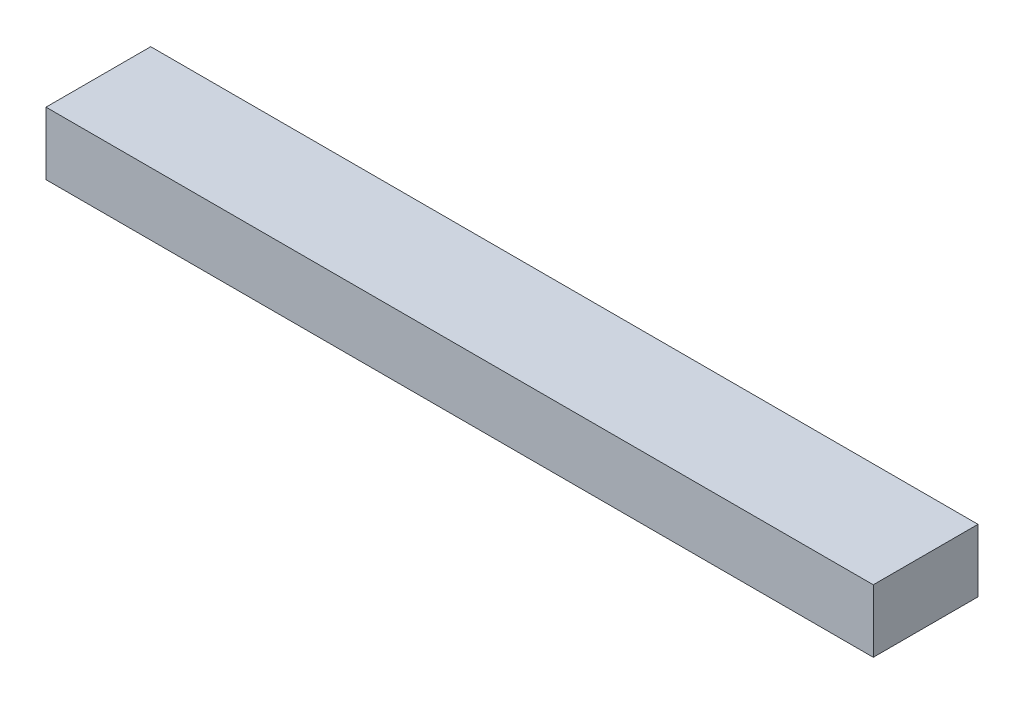
ISO-10303-21;
HEADER;
FILE_DESCRIPTION(('STEP AP214'),'2;1');
FILE_NAME('part.step','',(''),(''),'','','');
FILE_SCHEMA(('AUTOMOTIVE_DESIGN { 1 0 10303 214 1 1 1 1 }'));
ENDSEC;
DATA;
#1=APPLICATION_CONTEXT('core data for automotive mechanical design processes');
#2=APPLICATION_PROTOCOL_DEFINITION('international standard','automotive_design',2000,#1);
#3=PRODUCT_CONTEXT('',#1,'mechanical');
#4=PRODUCT('Part','Part','',(#3));
#5=PRODUCT_RELATED_PRODUCT_CATEGORY('part','',(#4));
#6=PRODUCT_DEFINITION_FORMATION('','',#4);
#7=PRODUCT_DEFINITION_CONTEXT('part definition',#1,'design');
#8=PRODUCT_DEFINITION('design','',#6,#7);
#9=PRODUCT_DEFINITION_SHAPE('','',#8);
#10=(LENGTH_UNIT() NAMED_UNIT(*) SI_UNIT(.MILLI.,.METRE.));
#11=(NAMED_UNIT(*) PLANE_ANGLE_UNIT() SI_UNIT($,.RADIAN.));
#12=(NAMED_UNIT(*) SI_UNIT($,.STERADIAN.) SOLID_ANGLE_UNIT());
#13=UNCERTAINTY_MEASURE_WITH_UNIT(LENGTH_MEASURE(1.E-05),#10,'distance_accuracy_value','');
#14=(GEOMETRIC_REPRESENTATION_CONTEXT(3) GLOBAL_UNCERTAINTY_ASSIGNED_CONTEXT((#13)) GLOBAL_UNIT_ASSIGNED_CONTEXT((#10,
#11,#12)) REPRESENTATION_CONTEXT('',''));
#15=CARTESIAN_POINT('',(0.,0.,0.));
#16=DIRECTION('',(0.,0.,1.));
#17=DIRECTION('',(1.,0.,0.));
#18=AXIS2_PLACEMENT_3D('',#15,#16,#17);
#19=CARTESIAN_POINT('',(0.,6.,10.));
#20=DIRECTION('',(1.,0.,0.));
#21=DIRECTION('',(0.,0.,-1.));
#22=AXIS2_PLACEMENT_3D('',#19,#20,#21);
#23=PLANE('',#22);
#24=DIRECTION('',(0.,0.,1.));
#25=VECTOR('',#24,1.);
#26=CARTESIAN_POINT('',(0.,0.,10.));
#27=LINE('',#26,#25);
#28=CARTESIAN_POINT('',(0.,0.,10.));
#29=VERTEX_POINT('',#28);
#30=CARTESIAN_POINT('',(0.,0.,20.));
#31=VERTEX_POINT('',#30);
#32=EDGE_CURVE('E96',#29,#31,#27,.T.);
#33=ORIENTED_EDGE('',*,*,#32,.T.);
#34=DIRECTION('',(0.,-1.,0.));
#35=VECTOR('',#34,1.);
#36=CARTESIAN_POINT('',(0.,6.,20.));
#37=LINE('',#36,#35);
#38=CARTESIAN_POINT('',(0.,6.,20.));
#39=VERTEX_POINT('',#38);
#40=EDGE_CURVE('E11',#39,#31,#37,.T.);
#41=ORIENTED_EDGE('',*,*,#40,.F.);
#42=DIRECTION('',(0.,0.,1.));
#43=VECTOR('',#42,1.);
#44=CARTESIAN_POINT('',(0.,6.,10.));
#45=LINE('',#44,#43);
#46=CARTESIAN_POINT('',(0.,6.,10.));
#47=VERTEX_POINT('',#46);
#48=EDGE_CURVE('E82',#47,#39,#45,.T.);
#49=ORIENTED_EDGE('',*,*,#48,.F.);
#50=DIRECTION('',(0.,-1.,0.));
#51=VECTOR('',#50,1.);
#52=CARTESIAN_POINT('',(0.,6.,10.));
#53=LINE('',#52,#51);
#54=EDGE_CURVE('E49',#47,#29,#53,.T.);
#55=ORIENTED_EDGE('',*,*,#54,.T.);
#56=EDGE_LOOP('',(#33,#41,#49,#55));
#57=FACE_BOUND('',#56,.T.);
#58=ADVANCED_FACE('F33',(#57),#23,.F.);
#59=CARTESIAN_POINT('',(0.,6.,20.));
#60=DIRECTION('',(0.,0.,-1.));
#61=DIRECTION('',(-1.,0.,0.));
#62=AXIS2_PLACEMENT_3D('',#59,#60,#61);
#63=PLANE('',#62);
#64=DIRECTION('',(1.,0.,0.));
#65=VECTOR('',#64,1.);
#66=CARTESIAN_POINT('',(0.,0.,20.));
#67=LINE('',#66,#65);
#68=CARTESIAN_POINT('',(79.,0.,20.));
#69=VERTEX_POINT('',#68);
#70=EDGE_CURVE('E87',#31,#69,#67,.T.);
#71=ORIENTED_EDGE('',*,*,#70,.T.);
#72=DIRECTION('',(0.,-1.,0.));
#73=VECTOR('',#72,1.);
#74=CARTESIAN_POINT('',(79.,6.,20.));
#75=LINE('',#74,#73);
#76=CARTESIAN_POINT('',(79.,6.,20.));
#77=VERTEX_POINT('',#76);
#78=EDGE_CURVE('E41',#77,#69,#75,.T.);
#79=ORIENTED_EDGE('',*,*,#78,.F.);
#80=DIRECTION('',(1.,0.,0.));
#81=VECTOR('',#80,1.);
#82=CARTESIAN_POINT('',(0.,6.,20.));
#83=LINE('',#82,#81);
#84=EDGE_CURVE('E74',#39,#77,#83,.T.);
#85=ORIENTED_EDGE('',*,*,#84,.F.);
#86=ORIENTED_EDGE('',*,*,#40,.T.);
#87=EDGE_LOOP('',(#71,#79,#85,#86));
#88=FACE_BOUND('',#87,.T.);
#89=ADVANCED_FACE('F86',(#88),#63,.F.);
#90=CARTESIAN_POINT('',(79.,6.,10.));
#91=DIRECTION('',(1.,0.,0.));
#92=DIRECTION('',(0.,0.,-1.));
#93=AXIS2_PLACEMENT_3D('',#90,#91,#92);
#94=PLANE('',#93);
#95=DIRECTION('',(0.,0.,1.));
#96=VECTOR('',#95,1.);
#97=CARTESIAN_POINT('',(79.,0.,10.));
#98=LINE('',#97,#96);
#99=CARTESIAN_POINT('',(79.,0.,10.));
#100=VERTEX_POINT('',#99);
#101=EDGE_CURVE('E99',#100,#69,#98,.T.);
#102=ORIENTED_EDGE('',*,*,#101,.F.);
#103=DIRECTION('',(0.,-1.,0.));
#104=VECTOR('',#103,1.);
#105=CARTESIAN_POINT('',(79.,6.,10.));
#106=LINE('',#105,#104);
#107=CARTESIAN_POINT('',(79.,6.,10.));
#108=VERTEX_POINT('',#107);
#109=EDGE_CURVE('E63',#108,#100,#106,.T.);
#110=ORIENTED_EDGE('',*,*,#109,.F.);
#111=DIRECTION('',(0.,0.,1.));
#112=VECTOR('',#111,1.);
#113=CARTESIAN_POINT('',(79.,6.,10.));
#114=LINE('',#113,#112);
#115=EDGE_CURVE('E81',#108,#77,#114,.T.);
#116=ORIENTED_EDGE('',*,*,#115,.T.);
#117=ORIENTED_EDGE('',*,*,#78,.T.);
#118=EDGE_LOOP('',(#102,#110,#116,#117));
#119=FACE_BOUND('',#118,.T.);
#120=ADVANCED_FACE('F90',(#119),#94,.T.);
#121=CARTESIAN_POINT('',(0.,6.,10.));
#122=DIRECTION('',(0.,0.,-1.));
#123=DIRECTION('',(-1.,0.,0.));
#124=AXIS2_PLACEMENT_3D('',#121,#122,#123);
#125=PLANE('',#124);
#126=DIRECTION('',(1.,0.,0.));
#127=VECTOR('',#126,1.);
#128=CARTESIAN_POINT('',(0.,0.,10.));
#129=LINE('',#128,#127);
#130=EDGE_CURVE('E101',#29,#100,#129,.T.);
#131=ORIENTED_EDGE('',*,*,#130,.F.);
#132=ORIENTED_EDGE('',*,*,#54,.F.);
#133=DIRECTION('',(1.,0.,0.));
#134=VECTOR('',#133,1.);
#135=CARTESIAN_POINT('',(0.,6.,10.));
#136=LINE('',#135,#134);
#137=EDGE_CURVE('E91',#47,#108,#136,.T.);
#138=ORIENTED_EDGE('',*,*,#137,.T.);
#139=ORIENTED_EDGE('',*,*,#109,.T.);
#140=EDGE_LOOP('',(#131,#132,#138,#139));
#141=FACE_BOUND('',#140,.T.);
#142=ADVANCED_FACE('F107',(#141),#125,.T.);
#143=CARTESIAN_POINT('',(0.,6.,0.));
#144=DIRECTION('',(0.,1.,0.));
#145=DIRECTION('',(0.,0.,1.));
#146=AXIS2_PLACEMENT_3D('',#143,#144,#145);
#147=PLANE('',#146);
#148=ORIENTED_EDGE('',*,*,#48,.T.);
#149=ORIENTED_EDGE('',*,*,#84,.T.);
#150=ORIENTED_EDGE('',*,*,#115,.F.);
#151=ORIENTED_EDGE('',*,*,#137,.F.);
#152=EDGE_LOOP('',(#148,#149,#150,#151));
#153=FACE_BOUND('',#152,.T.);
#154=ADVANCED_FACE('F78',(#153),#147,.T.);
#155=CARTESIAN_POINT('',(0.,0.,0.));
#156=DIRECTION('',(0.,1.,0.));
#157=DIRECTION('',(0.,0.,1.));
#158=AXIS2_PLACEMENT_3D('',#155,#156,#157);
#159=PLANE('',#158);
#160=ORIENTED_EDGE('',*,*,#32,.F.);
#161=ORIENTED_EDGE('',*,*,#130,.T.);
#162=ORIENTED_EDGE('',*,*,#101,.T.);
#163=ORIENTED_EDGE('',*,*,#70,.F.);
#164=EDGE_LOOP('',(#160,#161,#162,#163));
#165=FACE_BOUND('',#164,.T.);
#166=ADVANCED_FACE('F106',(#165),#159,.F.);
#167=CLOSED_SHELL('',(#58,#89,#120,#142,#154,#166));
#168=MANIFOLD_SOLID_BREP('B2',#167);
#169=ADVANCED_BREP_SHAPE_REPRESENTATION('',(#18,#168),#14);
#170=SHAPE_DEFINITION_REPRESENTATION(#9,#169);
ENDSEC;
END-ISO-10303-21;
